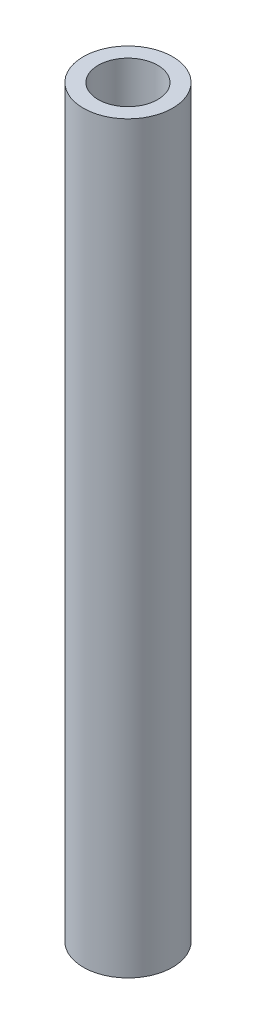
ISO-10303-21;
HEADER;
FILE_DESCRIPTION(('STEP AP214'),'2;1');
FILE_NAME('part.step','',(''),(''),'','','');
FILE_SCHEMA(('AUTOMOTIVE_DESIGN { 1 0 10303 214 1 1 1 1 }'));
ENDSEC;
DATA;
#1=APPLICATION_CONTEXT('core data for automotive mechanical design processes');
#2=APPLICATION_PROTOCOL_DEFINITION('international standard','automotive_design',2000,#1);
#3=PRODUCT_CONTEXT('',#1,'mechanical');
#4=PRODUCT('Part','Part','',(#3));
#5=PRODUCT_RELATED_PRODUCT_CATEGORY('part','',(#4));
#6=PRODUCT_DEFINITION_FORMATION('','',#4);
#7=PRODUCT_DEFINITION_CONTEXT('part definition',#1,'design');
#8=PRODUCT_DEFINITION('design','',#6,#7);
#9=PRODUCT_DEFINITION_SHAPE('','',#8);
#10=(LENGTH_UNIT() NAMED_UNIT(*) SI_UNIT(.MILLI.,.METRE.));
#11=(NAMED_UNIT(*) PLANE_ANGLE_UNIT() SI_UNIT($,.RADIAN.));
#12=(NAMED_UNIT(*) SI_UNIT($,.STERADIAN.) SOLID_ANGLE_UNIT());
#13=UNCERTAINTY_MEASURE_WITH_UNIT(LENGTH_MEASURE(1.E-05),#10,'distance_accuracy_value','');
#14=(GEOMETRIC_REPRESENTATION_CONTEXT(3) GLOBAL_UNCERTAINTY_ASSIGNED_CONTEXT((#13)) GLOBAL_UNIT_ASSIGNED_CONTEXT((#10,
#11,#12)) REPRESENTATION_CONTEXT('',''));
#15=CARTESIAN_POINT('',(0.,0.,0.));
#16=DIRECTION('',(0.,0.,1.));
#17=DIRECTION('',(1.,0.,0.));
#18=AXIS2_PLACEMENT_3D('',#15,#16,#17);
#19=CARTESIAN_POINT('',(0.,0.,0.));
#20=DIRECTION('',(0.,1.,0.));
#21=DIRECTION('',(1.,0.,0.));
#22=AXIS2_PLACEMENT_3D('',#19,#20,#21);
#23=PLANE('',#22);
#24=CARTESIAN_POINT('',(0.,0.,0.));
#25=DIRECTION('',(0.,-1.,0.));
#26=DIRECTION('',(1.,0.,0.));
#27=AXIS2_PLACEMENT_3D('',#24,#25,#26);
#28=CIRCLE('',#27,1.);
#29=CARTESIAN_POINT('',(-1.,0.,0.));
#30=VERTEX_POINT('',#29);
#31=EDGE_CURVE('E55',#30,#30,#28,.T.);
#32=ORIENTED_EDGE('',*,*,#31,.F.);
#33=EDGE_LOOP('',(#32));
#34=FACE_BOUND('',#33,.T.);
#35=CARTESIAN_POINT('',(0.,0.,0.));
#36=DIRECTION('',(0.,1.,0.));
#37=DIRECTION('',(1.,0.,0.));
#38=AXIS2_PLACEMENT_3D('',#35,#36,#37);
#39=CIRCLE('',#38,1.5);
#40=CARTESIAN_POINT('',(-1.5,0.,0.));
#41=VERTEX_POINT('',#40);
#42=EDGE_CURVE('E11',#41,#41,#39,.T.);
#43=ORIENTED_EDGE('',*,*,#42,.F.);
#44=EDGE_LOOP('',(#43));
#45=FACE_BOUND('',#44,.T.);
#46=ADVANCED_FACE('F17',(#34,#45),#23,.F.);
#47=CARTESIAN_POINT('',(0.,-1.25,0.));
#48=DIRECTION('',(0.,1.,0.));
#49=DIRECTION('',(1.,0.,0.));
#50=AXIS2_PLACEMENT_3D('',#47,#48,#49);
#51=CYLINDRICAL_SURFACE('',#50,1.5);
#52=CARTESIAN_POINT('',(0.,25.,0.));
#53=DIRECTION('',(0.,1.,0.));
#54=DIRECTION('',(1.,0.,0.));
#55=AXIS2_PLACEMENT_3D('',#52,#53,#54);
#56=CIRCLE('',#55,1.5);
#57=CARTESIAN_POINT('',(-1.5,25.,0.));
#58=VERTEX_POINT('',#57);
#59=EDGE_CURVE('E63',#58,#58,#56,.T.);
#60=ORIENTED_EDGE('',*,*,#59,.F.);
#61=DIRECTION('',(0.,-1.,0.));
#62=VECTOR('',#61,1.);
#63=CARTESIAN_POINT('',(-1.5,-1.25,0.));
#64=LINE('',#63,#62);
#65=EDGE_CURVE('E20',#58,#41,#64,.T.);
#66=ORIENTED_EDGE('',*,*,#65,.T.);
#67=ORIENTED_EDGE('',*,*,#42,.T.);
#68=ORIENTED_EDGE('',*,*,#65,.F.);
#69=EDGE_LOOP('',(#60,#66,#67,#68));
#70=FACE_BOUND('',#69,.T.);
#71=ADVANCED_FACE('F75',(#70),#51,.T.);
#72=CARTESIAN_POINT('',(0.,25.,0.));
#73=DIRECTION('',(0.,1.,0.));
#74=DIRECTION('',(1.,0.,0.));
#75=AXIS2_PLACEMENT_3D('',#72,#73,#74);
#76=PLANE('',#75);
#77=CARTESIAN_POINT('',(0.,25.,0.));
#78=DIRECTION('',(0.,1.,0.));
#79=DIRECTION('',(1.,0.,0.));
#80=AXIS2_PLACEMENT_3D('',#77,#78,#79);
#81=CIRCLE('',#80,1.);
#82=CARTESIAN_POINT('',(-1.,25.,0.));
#83=VERTEX_POINT('',#82);
#84=EDGE_CURVE('E48',#83,#83,#81,.T.);
#85=ORIENTED_EDGE('',*,*,#84,.F.);
#86=EDGE_LOOP('',(#85));
#87=FACE_BOUND('',#86,.T.);
#88=ORIENTED_EDGE('',*,*,#59,.T.);
#89=EDGE_LOOP('',(#88));
#90=FACE_BOUND('',#89,.T.);
#91=ADVANCED_FACE('F77',(#87,#90),#76,.T.);
#92=CARTESIAN_POINT('',(0.,-1.25,0.));
#93=DIRECTION('',(0.,1.,0.));
#94=DIRECTION('',(1.,0.,0.));
#95=AXIS2_PLACEMENT_3D('',#92,#93,#94);
#96=CYLINDRICAL_SURFACE('',#95,1.);
#97=ORIENTED_EDGE('',*,*,#31,.T.);
#98=DIRECTION('',(0.,1.,0.));
#99=VECTOR('',#98,1.);
#100=CARTESIAN_POINT('',(-1.,-1.25,0.));
#101=LINE('',#100,#99);
#102=EDGE_CURVE('E52',#30,#83,#101,.T.);
#103=ORIENTED_EDGE('',*,*,#102,.T.);
#104=ORIENTED_EDGE('',*,*,#84,.T.);
#105=ORIENTED_EDGE('',*,*,#102,.F.);
#106=EDGE_LOOP('',(#97,#103,#104,#105));
#107=FACE_BOUND('',#106,.T.);
#108=ADVANCED_FACE('F53',(#107),#96,.F.);
#109=CLOSED_SHELL('',(#46,#71,#91,#108));
#110=MANIFOLD_SOLID_BREP('B1',#109);
#111=ADVANCED_BREP_SHAPE_REPRESENTATION('',(#18,#110),#14);
#112=SHAPE_DEFINITION_REPRESENTATION(#9,#111);
ENDSEC;
END-ISO-10303-21;
